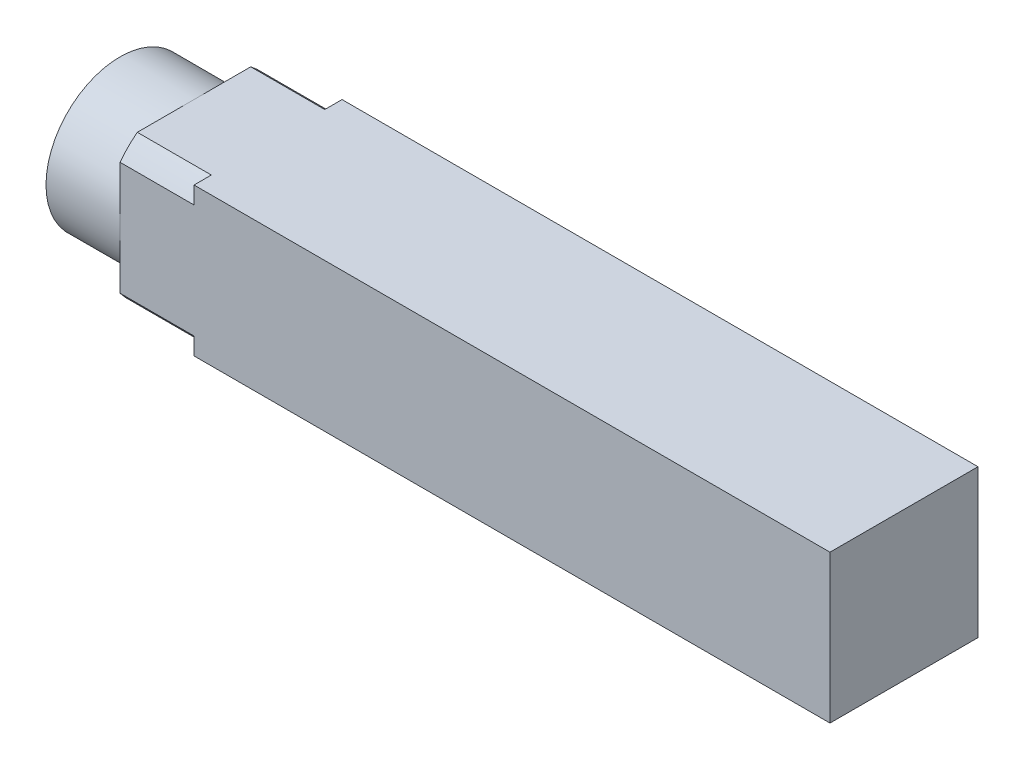
ISO-10303-21;
HEADER;
FILE_DESCRIPTION(('STEP AP214'),'2;1');
FILE_NAME('part.step','',(''),(''),'','','');
FILE_SCHEMA(('AUTOMOTIVE_DESIGN { 1 0 10303 214 1 1 1 1 }'));
ENDSEC;
DATA;
#1=APPLICATION_CONTEXT('core data for automotive mechanical design processes');
#2=APPLICATION_PROTOCOL_DEFINITION('international standard','automotive_design',2000,#1);
#3=PRODUCT_CONTEXT('',#1,'mechanical');
#4=PRODUCT('Part','Part','',(#3));
#5=PRODUCT_RELATED_PRODUCT_CATEGORY('part','',(#4));
#6=PRODUCT_DEFINITION_FORMATION('','',#4);
#7=PRODUCT_DEFINITION_CONTEXT('part definition',#1,'design');
#8=PRODUCT_DEFINITION('design','',#6,#7);
#9=PRODUCT_DEFINITION_SHAPE('','',#8);
#10=(LENGTH_UNIT() NAMED_UNIT(*) SI_UNIT(.MILLI.,.METRE.));
#11=(NAMED_UNIT(*) PLANE_ANGLE_UNIT() SI_UNIT($,.RADIAN.));
#12=(NAMED_UNIT(*) SI_UNIT($,.STERADIAN.) SOLID_ANGLE_UNIT());
#13=UNCERTAINTY_MEASURE_WITH_UNIT(LENGTH_MEASURE(1.E-05),#10,'distance_accuracy_value','');
#14=(GEOMETRIC_REPRESENTATION_CONTEXT(3) GLOBAL_UNCERTAINTY_ASSIGNED_CONTEXT((#13)) GLOBAL_UNIT_ASSIGNED_CONTEXT((#10,
#11,#12)) REPRESENTATION_CONTEXT('',''));
#15=CARTESIAN_POINT('',(0.,0.,0.));
#16=DIRECTION('',(0.,0.,1.));
#17=DIRECTION('',(1.,0.,0.));
#18=AXIS2_PLACEMENT_3D('',#15,#16,#17);
#19=CARTESIAN_POINT('',(3.175,0.,0.));
#20=DIRECTION('',(-1.,0.,0.));
#21=DIRECTION('',(0.,0.,1.));
#22=AXIS2_PLACEMENT_3D('',#19,#20,#21);
#23=PLANE('',#22);
#24=CARTESIAN_POINT('',(3.175,0.,0.));
#25=DIRECTION('',(1.,0.,0.));
#26=DIRECTION('',(0.,0.,-1.));
#27=AXIS2_PLACEMENT_3D('',#24,#25,#26);
#28=CIRCLE('',#27,4.);
#29=CARTESIAN_POINT('',(3.175,3.175,2.43297657202037));
#30=VERTEX_POINT('',#29);
#31=CARTESIAN_POINT('',(3.175,2.43297657202037,3.175));
#32=VERTEX_POINT('',#31);
#33=EDGE_CURVE('E250',#30,#32,#28,.T.);
#34=ORIENTED_EDGE('',*,*,#33,.F.);
#35=DIRECTION('',(0.,0.,-1.));
#36=VECTOR('',#35,1.);
#37=CARTESIAN_POINT('',(3.175,3.175,3.175));
#38=LINE('',#37,#36);
#39=CARTESIAN_POINT('',(3.175,3.175,0.));
#40=VERTEX_POINT('',#39);
#41=EDGE_CURVE('E199',#30,#40,#38,.T.);
#42=ORIENTED_EDGE('',*,*,#41,.T.);
#43=CARTESIAN_POINT('',(3.175,0.,0.));
#44=DIRECTION('',(-1.,0.,0.));
#45=DIRECTION('',(0.,0.,1.));
#46=AXIS2_PLACEMENT_3D('',#43,#44,#45);
#47=CIRCLE('',#46,3.175);
#48=CARTESIAN_POINT('',(3.175,0.,3.175));
#49=VERTEX_POINT('',#48);
#50=EDGE_CURVE('E185',#49,#40,#47,.T.);
#51=ORIENTED_EDGE('',*,*,#50,.F.);
#52=DIRECTION('',(0.,1.,0.));
#53=VECTOR('',#52,1.);
#54=CARTESIAN_POINT('',(3.175,-3.175,3.175));
#55=LINE('',#54,#53);
#56=EDGE_CURVE('E193',#49,#32,#55,.T.);
#57=ORIENTED_EDGE('',*,*,#56,.T.);
#58=EDGE_LOOP('',(#34,#42,#51,#57));
#59=FACE_BOUND('',#58,.T.);
#60=ADVANCED_FACE('F39',(#59),#23,.T.);
#61=CARTESIAN_POINT('',(3.175,0.,0.));
#62=DIRECTION('',(1.,0.,0.));
#63=DIRECTION('',(0.,0.,-1.));
#64=AXIS2_PLACEMENT_3D('',#61,#62,#63);
#65=CIRCLE('',#64,4.);
#66=CARTESIAN_POINT('',(3.175,2.43297657202037,-3.175));
#67=VERTEX_POINT('',#66);
#68=CARTESIAN_POINT('',(3.175,3.175,-2.43297657202037));
#69=VERTEX_POINT('',#68);
#70=EDGE_CURVE('E249',#67,#69,#65,.T.);
#71=ORIENTED_EDGE('',*,*,#70,.F.);
#72=DIRECTION('',(0.,-1.,0.));
#73=VECTOR('',#72,1.);
#74=CARTESIAN_POINT('',(3.175,-3.175,-3.175));
#75=LINE('',#74,#73);
#76=CARTESIAN_POINT('',(3.175,0.,-3.175));
#77=VERTEX_POINT('',#76);
#78=EDGE_CURVE('E198',#67,#77,#75,.T.);
#79=ORIENTED_EDGE('',*,*,#78,.T.);
#80=EDGE_CURVE('E186',#40,#77,#47,.T.);
#81=ORIENTED_EDGE('',*,*,#80,.F.);
#82=EDGE_CURVE('E197',#40,#69,#38,.T.);
#83=ORIENTED_EDGE('',*,*,#82,.T.);
#84=EDGE_LOOP('',(#71,#79,#81,#83));
#85=FACE_BOUND('',#84,.T.);
#86=ADVANCED_FACE('F271',(#85),#23,.T.);
#87=CARTESIAN_POINT('',(3.175,0.,0.));
#88=DIRECTION('',(1.,0.,0.));
#89=DIRECTION('',(0.,0.,-1.));
#90=AXIS2_PLACEMENT_3D('',#87,#88,#89);
#91=CIRCLE('',#90,4.);
#92=CARTESIAN_POINT('',(3.175,-3.175,-2.43297657202037));
#93=VERTEX_POINT('',#92);
#94=CARTESIAN_POINT('',(3.175,-2.43297657202037,-3.175));
#95=VERTEX_POINT('',#94);
#96=EDGE_CURVE('E230',#93,#95,#91,.T.);
#97=ORIENTED_EDGE('',*,*,#96,.F.);
#98=DIRECTION('',(0.,0.,1.));
#99=VECTOR('',#98,1.);
#100=CARTESIAN_POINT('',(3.175,-3.175,3.175));
#101=LINE('',#100,#99);
#102=CARTESIAN_POINT('',(3.175,-3.175,0.));
#103=VERTEX_POINT('',#102);
#104=EDGE_CURVE('E147',#93,#103,#101,.T.);
#105=ORIENTED_EDGE('',*,*,#104,.T.);
#106=EDGE_CURVE('E229',#77,#103,#47,.T.);
#107=ORIENTED_EDGE('',*,*,#106,.F.);
#108=EDGE_CURVE('E195',#77,#95,#75,.T.);
#109=ORIENTED_EDGE('',*,*,#108,.T.);
#110=EDGE_LOOP('',(#97,#105,#107,#109));
#111=FACE_BOUND('',#110,.T.);
#112=ADVANCED_FACE('F227',(#111),#23,.T.);
#113=CARTESIAN_POINT('',(3.175,0.,0.));
#114=DIRECTION('',(1.,0.,0.));
#115=DIRECTION('',(0.,0.,-1.));
#116=AXIS2_PLACEMENT_3D('',#113,#114,#115);
#117=CIRCLE('',#116,4.);
#118=CARTESIAN_POINT('',(3.175,-2.43297657202037,3.175));
#119=VERTEX_POINT('',#118);
#120=CARTESIAN_POINT('',(3.175,-3.175,2.43297657202037));
#121=VERTEX_POINT('',#120);
#122=EDGE_CURVE('E243',#119,#121,#117,.T.);
#123=ORIENTED_EDGE('',*,*,#122,.F.);
#124=EDGE_CURVE('E183',#119,#49,#55,.T.);
#125=ORIENTED_EDGE('',*,*,#124,.T.);
#126=EDGE_CURVE('E187',#103,#49,#47,.T.);
#127=ORIENTED_EDGE('',*,*,#126,.F.);
#128=EDGE_CURVE('E218',#103,#121,#101,.T.);
#129=ORIENTED_EDGE('',*,*,#128,.T.);
#130=EDGE_LOOP('',(#123,#125,#127,#129));
#131=FACE_BOUND('',#130,.T.);
#132=ADVANCED_FACE('F240',(#131),#23,.T.);
#133=CARTESIAN_POINT('',(33.63214,-3.175,-3.175));
#134=DIRECTION('',(0.,0.,1.));
#135=DIRECTION('',(1.,0.,0.));
#136=AXIS2_PLACEMENT_3D('',#133,#134,#135);
#137=PLANE('',#136);
#138=DIRECTION('',(-1.,0.,0.));
#139=VECTOR('',#138,1.);
#140=CARTESIAN_POINT('',(33.63214,-3.175,-3.175));
#141=LINE('',#140,#139);
#142=CARTESIAN_POINT('',(33.63214,-3.175,-3.175));
#143=VERTEX_POINT('',#142);
#144=CARTESIAN_POINT('',(6.35,-3.175,-3.175));
#145=VERTEX_POINT('',#144);
#146=EDGE_CURVE('E209',#143,#145,#141,.T.);
#147=ORIENTED_EDGE('',*,*,#146,.T.);
#148=DIRECTION('',(0.,1.,0.));
#149=VECTOR('',#148,1.);
#150=CARTESIAN_POINT('',(6.35,-3.175,-3.175));
#151=LINE('',#150,#149);
#152=CARTESIAN_POINT('',(6.35,-2.43297657202037,-3.175));
#153=VERTEX_POINT('',#152);
#154=EDGE_CURVE('E144',#145,#153,#151,.T.);
#155=ORIENTED_EDGE('',*,*,#154,.T.);
#156=DIRECTION('',(-1.,0.,0.));
#157=VECTOR('',#156,1.);
#158=CARTESIAN_POINT('',(6.35,-2.43297657202037,-3.175));
#159=LINE('',#158,#157);
#160=EDGE_CURVE('E156',#153,#95,#159,.T.);
#161=ORIENTED_EDGE('',*,*,#160,.T.);
#162=ORIENTED_EDGE('',*,*,#108,.F.);
#163=ORIENTED_EDGE('',*,*,#78,.F.);
#164=DIRECTION('',(-1.,0.,0.));
#165=VECTOR('',#164,1.);
#166=CARTESIAN_POINT('',(6.35,2.43297657202037,-3.175));
#167=LINE('',#166,#165);
#168=CARTESIAN_POINT('',(6.35,2.43297657202037,-3.175));
#169=VERTEX_POINT('',#168);
#170=EDGE_CURVE('E169',#169,#67,#167,.T.);
#171=ORIENTED_EDGE('',*,*,#170,.F.);
#172=CARTESIAN_POINT('',(6.35,3.175,-3.175));
#173=VERTEX_POINT('',#172);
#174=EDGE_CURVE('E173',#169,#173,#151,.T.);
#175=ORIENTED_EDGE('',*,*,#174,.T.);
#176=DIRECTION('',(-1.,0.,0.));
#177=VECTOR('',#176,1.);
#178=CARTESIAN_POINT('',(33.63214,3.175,-3.175));
#179=LINE('',#178,#177);
#180=CARTESIAN_POINT('',(33.63214,3.175,-3.175));
#181=VERTEX_POINT('',#180);
#182=EDGE_CURVE('E220',#181,#173,#179,.T.);
#183=ORIENTED_EDGE('',*,*,#182,.F.);
#184=DIRECTION('',(0.,1.,0.));
#185=VECTOR('',#184,1.);
#186=CARTESIAN_POINT('',(33.63214,-3.175,-3.175));
#187=LINE('',#186,#185);
#188=EDGE_CURVE('E203',#143,#181,#187,.T.);
#189=ORIENTED_EDGE('',*,*,#188,.F.);
#190=EDGE_LOOP('',(#147,#155,#161,#162,#163,#171,#175,#183,#189));
#191=FACE_BOUND('',#190,.T.);
#192=ADVANCED_FACE('F41',(#191),#137,.F.);
#193=CARTESIAN_POINT('',(33.63214,3.175,3.175));
#194=DIRECTION('',(0.,-1.,0.));
#195=DIRECTION('',(0.,0.,-1.));
#196=AXIS2_PLACEMENT_3D('',#193,#194,#195);
#197=PLANE('',#196);
#198=ORIENTED_EDGE('',*,*,#182,.T.);
#199=DIRECTION('',(0.,0.,1.));
#200=VECTOR('',#199,1.);
#201=CARTESIAN_POINT('',(6.35,3.175,3.175));
#202=LINE('',#201,#200);
#203=CARTESIAN_POINT('',(6.35,3.175,-2.43297657202037));
#204=VERTEX_POINT('',#203);
#205=EDGE_CURVE('E182',#173,#204,#202,.T.);
#206=ORIENTED_EDGE('',*,*,#205,.T.);
#207=DIRECTION('',(-1.,0.,0.));
#208=VECTOR('',#207,1.);
#209=CARTESIAN_POINT('',(6.35,3.175,-2.43297657202037));
#210=LINE('',#209,#208);
#211=EDGE_CURVE('E53',#204,#69,#210,.T.);
#212=ORIENTED_EDGE('',*,*,#211,.T.);
#213=ORIENTED_EDGE('',*,*,#82,.F.);
#214=ORIENTED_EDGE('',*,*,#41,.F.);
#215=DIRECTION('',(-1.,0.,0.));
#216=VECTOR('',#215,1.);
#217=CARTESIAN_POINT('',(6.35,3.175,2.43297657202037));
#218=LINE('',#217,#216);
#219=CARTESIAN_POINT('',(6.35,3.175,2.43297657202037));
#220=VERTEX_POINT('',#219);
#221=EDGE_CURVE('E265',#220,#30,#218,.T.);
#222=ORIENTED_EDGE('',*,*,#221,.F.);
#223=CARTESIAN_POINT('',(6.35,3.175,3.175));
#224=VERTEX_POINT('',#223);
#225=EDGE_CURVE('E178',#220,#224,#202,.T.);
#226=ORIENTED_EDGE('',*,*,#225,.T.);
#227=DIRECTION('',(-1.,0.,0.));
#228=VECTOR('',#227,1.);
#229=CARTESIAN_POINT('',(33.63214,3.175,3.175));
#230=LINE('',#229,#228);
#231=CARTESIAN_POINT('',(33.63214,3.175,3.175));
#232=VERTEX_POINT('',#231);
#233=EDGE_CURVE('E212',#232,#224,#230,.T.);
#234=ORIENTED_EDGE('',*,*,#233,.F.);
#235=DIRECTION('',(0.,0.,1.));
#236=VECTOR('',#235,1.);
#237=CARTESIAN_POINT('',(33.63214,3.175,3.175));
#238=LINE('',#237,#236);
#239=EDGE_CURVE('E204',#181,#232,#238,.T.);
#240=ORIENTED_EDGE('',*,*,#239,.F.);
#241=EDGE_LOOP('',(#198,#206,#212,#213,#214,#222,#226,#234,#240));
#242=FACE_BOUND('',#241,.T.);
#243=ADVANCED_FACE('F285',(#242),#197,.F.);
#244=CARTESIAN_POINT('',(33.63214,-3.175,3.175));
#245=DIRECTION('',(0.,0.,-1.));
#246=DIRECTION('',(-1.,0.,0.));
#247=AXIS2_PLACEMENT_3D('',#244,#245,#246);
#248=PLANE('',#247);
#249=ORIENTED_EDGE('',*,*,#233,.T.);
#250=DIRECTION('',(0.,-1.,0.));
#251=VECTOR('',#250,1.);
#252=CARTESIAN_POINT('',(6.35,-3.175,3.175));
#253=LINE('',#252,#251);
#254=CARTESIAN_POINT('',(6.35,2.43297657202037,3.175));
#255=VERTEX_POINT('',#254);
#256=EDGE_CURVE('E180',#224,#255,#253,.T.);
#257=ORIENTED_EDGE('',*,*,#256,.T.);
#258=DIRECTION('',(-1.,0.,0.));
#259=VECTOR('',#258,1.);
#260=CARTESIAN_POINT('',(6.35,2.43297657202037,3.175));
#261=LINE('',#260,#259);
#262=EDGE_CURVE('E259',#255,#32,#261,.T.);
#263=ORIENTED_EDGE('',*,*,#262,.T.);
#264=ORIENTED_EDGE('',*,*,#56,.F.);
#265=ORIENTED_EDGE('',*,*,#124,.F.);
#266=DIRECTION('',(-1.,0.,0.));
#267=VECTOR('',#266,1.);
#268=CARTESIAN_POINT('',(6.35,-2.43297657202037,3.175));
#269=LINE('',#268,#267);
#270=CARTESIAN_POINT('',(6.35,-2.43297657202037,3.175));
#271=VERTEX_POINT('',#270);
#272=EDGE_CURVE('E255',#271,#119,#269,.T.);
#273=ORIENTED_EDGE('',*,*,#272,.F.);
#274=CARTESIAN_POINT('',(6.35,-3.175,3.175));
#275=VERTEX_POINT('',#274);
#276=EDGE_CURVE('E174',#271,#275,#253,.T.);
#277=ORIENTED_EDGE('',*,*,#276,.T.);
#278=DIRECTION('',(-1.,0.,0.));
#279=VECTOR('',#278,1.);
#280=CARTESIAN_POINT('',(33.63214,-3.175,3.175));
#281=LINE('',#280,#279);
#282=CARTESIAN_POINT('',(33.63214,-3.175,3.175));
#283=VERTEX_POINT('',#282);
#284=EDGE_CURVE('E215',#283,#275,#281,.T.);
#285=ORIENTED_EDGE('',*,*,#284,.F.);
#286=DIRECTION('',(0.,-1.,0.));
#287=VECTOR('',#286,1.);
#288=CARTESIAN_POINT('',(33.63214,-3.175,3.175));
#289=LINE('',#288,#287);
#290=EDGE_CURVE('E206',#232,#283,#289,.T.);
#291=ORIENTED_EDGE('',*,*,#290,.F.);
#292=EDGE_LOOP('',(#249,#257,#263,#264,#265,#273,#277,#285,#291));
#293=FACE_BOUND('',#292,.T.);
#294=ADVANCED_FACE('F276',(#293),#248,.F.);
#295=CARTESIAN_POINT('',(33.63214,-3.175,3.175));
#296=DIRECTION('',(0.,1.,0.));
#297=DIRECTION('',(0.,0.,1.));
#298=AXIS2_PLACEMENT_3D('',#295,#296,#297);
#299=PLANE('',#298);
#300=ORIENTED_EDGE('',*,*,#284,.T.);
#301=DIRECTION('',(0.,0.,-1.));
#302=VECTOR('',#301,1.);
#303=CARTESIAN_POINT('',(6.35,-3.175,3.175));
#304=LINE('',#303,#302);
#305=CARTESIAN_POINT('',(6.35,-3.175,2.43297657202037));
#306=VERTEX_POINT('',#305);
#307=EDGE_CURVE('E11',#275,#306,#304,.T.);
#308=ORIENTED_EDGE('',*,*,#307,.T.);
#309=DIRECTION('',(-1.,0.,0.));
#310=VECTOR('',#309,1.);
#311=CARTESIAN_POINT('',(6.35,-3.175,2.43297657202037));
#312=LINE('',#311,#310);
#313=EDGE_CURVE('E163',#306,#121,#312,.T.);
#314=ORIENTED_EDGE('',*,*,#313,.T.);
#315=ORIENTED_EDGE('',*,*,#128,.F.);
#316=ORIENTED_EDGE('',*,*,#104,.F.);
#317=DIRECTION('',(-1.,0.,0.));
#318=VECTOR('',#317,1.);
#319=CARTESIAN_POINT('',(6.35,-3.175,-2.43297657202037));
#320=LINE('',#319,#318);
#321=CARTESIAN_POINT('',(6.35,-3.175,-2.43297657202037));
#322=VERTEX_POINT('',#321);
#323=EDGE_CURVE('E153',#322,#93,#320,.T.);
#324=ORIENTED_EDGE('',*,*,#323,.F.);
#325=EDGE_CURVE('E43',#322,#145,#304,.T.);
#326=ORIENTED_EDGE('',*,*,#325,.T.);
#327=ORIENTED_EDGE('',*,*,#146,.F.);
#328=DIRECTION('',(0.,0.,-1.));
#329=VECTOR('',#328,1.);
#330=CARTESIAN_POINT('',(33.63214,-3.175,3.175));
#331=LINE('',#330,#329);
#332=EDGE_CURVE('E208',#283,#143,#331,.T.);
#333=ORIENTED_EDGE('',*,*,#332,.F.);
#334=EDGE_LOOP('',(#300,#308,#314,#315,#316,#324,#326,#327,#333));
#335=FACE_BOUND('',#334,.T.);
#336=ADVANCED_FACE('F165',(#335),#299,.F.);
#337=CARTESIAN_POINT('',(33.63214,0.,0.));
#338=DIRECTION('',(-1.,0.,0.));
#339=DIRECTION('',(0.,0.,1.));
#340=AXIS2_PLACEMENT_3D('',#337,#338,#339);
#341=PLANE('',#340);
#342=ORIENTED_EDGE('',*,*,#188,.T.);
#343=ORIENTED_EDGE('',*,*,#239,.T.);
#344=ORIENTED_EDGE('',*,*,#290,.T.);
#345=ORIENTED_EDGE('',*,*,#332,.T.);
#346=EDGE_LOOP('',(#342,#343,#344,#345));
#347=FACE_BOUND('',#346,.T.);
#348=ADVANCED_FACE('F387',(#347),#341,.F.);
#349=CARTESIAN_POINT('',(3.175,0.,0.));
#350=DIRECTION('',(-1.,0.,0.));
#351=DIRECTION('',(0.,0.,1.));
#352=AXIS2_PLACEMENT_3D('',#349,#350,#351);
#353=CYLINDRICAL_SURFACE('',#352,3.175);
#354=CARTESIAN_POINT('',(0.,0.,0.));
#355=DIRECTION('',(-1.,0.,0.));
#356=DIRECTION('',(0.,0.,1.));
#357=AXIS2_PLACEMENT_3D('',#354,#355,#356);
#358=CIRCLE('',#357,3.175);
#359=CARTESIAN_POINT('',(0.,0.,3.175));
#360=VERTEX_POINT('',#359);
#361=EDGE_CURVE('E189',#360,#360,#358,.T.);
#362=ORIENTED_EDGE('',*,*,#361,.F.);
#363=EDGE_LOOP('',(#362));
#364=FACE_BOUND('',#363,.T.);
#365=ORIENTED_EDGE('',*,*,#80,.T.);
#366=ORIENTED_EDGE('',*,*,#106,.T.);
#367=ORIENTED_EDGE('',*,*,#126,.T.);
#368=ORIENTED_EDGE('',*,*,#50,.T.);
#369=EDGE_LOOP('',(#365,#366,#367,#368));
#370=FACE_BOUND('',#369,.T.);
#371=ADVANCED_FACE('F233',(#364,#370),#353,.T.);
#372=CARTESIAN_POINT('',(0.,0.,0.));
#373=DIRECTION('',(-1.,0.,0.));
#374=DIRECTION('',(0.,0.,1.));
#375=AXIS2_PLACEMENT_3D('',#372,#373,#374);
#376=PLANE('',#375);
#377=ORIENTED_EDGE('',*,*,#361,.T.);
#378=EDGE_LOOP('',(#377));
#379=FACE_BOUND('',#378,.T.);
#380=ADVANCED_FACE('F301',(#379),#376,.T.);
#381=CARTESIAN_POINT('',(6.35,0.,0.));
#382=DIRECTION('',(1.,0.,0.));
#383=DIRECTION('',(0.,0.,-1.));
#384=AXIS2_PLACEMENT_3D('',#381,#382,#383);
#385=PLANE('',#384);
#386=ORIENTED_EDGE('',*,*,#325,.F.);
#387=CARTESIAN_POINT('',(6.35,0.,0.));
#388=DIRECTION('',(1.,0.,0.));
#389=DIRECTION('',(0.,0.,-1.));
#390=AXIS2_PLACEMENT_3D('',#387,#388,#389);
#391=CIRCLE('',#390,4.);
#392=EDGE_CURVE('E142',#322,#153,#391,.T.);
#393=ORIENTED_EDGE('',*,*,#392,.T.);
#394=ORIENTED_EDGE('',*,*,#154,.F.);
#395=EDGE_LOOP('',(#386,#393,#394));
#396=FACE_BOUND('',#395,.T.);
#397=ADVANCED_FACE('F143',(#396),#385,.F.);
#398=CARTESIAN_POINT('',(6.35,0.,0.));
#399=DIRECTION('',(-1.,0.,0.));
#400=DIRECTION('',(0.,0.,1.));
#401=AXIS2_PLACEMENT_3D('',#398,#399,#400);
#402=CYLINDRICAL_SURFACE('',#401,4.);
#403=ORIENTED_EDGE('',*,*,#96,.T.);
#404=ORIENTED_EDGE('',*,*,#160,.F.);
#405=ORIENTED_EDGE('',*,*,#392,.F.);
#406=ORIENTED_EDGE('',*,*,#323,.T.);
#407=EDGE_LOOP('',(#403,#404,#405,#406));
#408=FACE_BOUND('',#407,.T.);
#409=ADVANCED_FACE('F155',(#408),#402,.T.);
#410=CARTESIAN_POINT('',(6.35,0.,0.));
#411=DIRECTION('',(1.,0.,0.));
#412=DIRECTION('',(0.,0.,-1.));
#413=AXIS2_PLACEMENT_3D('',#410,#411,#412);
#414=CIRCLE('',#413,4.);
#415=EDGE_CURVE('E158',#271,#306,#414,.T.);
#416=ORIENTED_EDGE('',*,*,#415,.T.);
#417=ORIENTED_EDGE('',*,*,#307,.F.);
#418=ORIENTED_EDGE('',*,*,#276,.F.);
#419=EDGE_LOOP('',(#416,#417,#418));
#420=FACE_BOUND('',#419,.T.);
#421=ADVANCED_FACE('F247',(#420),#385,.F.);
#422=CARTESIAN_POINT('',(6.35,0.,0.));
#423=DIRECTION('',(-1.,0.,0.));
#424=DIRECTION('',(0.,0.,1.));
#425=AXIS2_PLACEMENT_3D('',#422,#423,#424);
#426=CYLINDRICAL_SURFACE('',#425,4.);
#427=ORIENTED_EDGE('',*,*,#122,.T.);
#428=ORIENTED_EDGE('',*,*,#313,.F.);
#429=ORIENTED_EDGE('',*,*,#415,.F.);
#430=ORIENTED_EDGE('',*,*,#272,.T.);
#431=EDGE_LOOP('',(#427,#428,#429,#430));
#432=FACE_BOUND('',#431,.T.);
#433=ADVANCED_FACE('F242',(#432),#426,.T.);
#434=CARTESIAN_POINT('',(6.35,0.,0.));
#435=DIRECTION('',(1.,0.,0.));
#436=DIRECTION('',(0.,0.,-1.));
#437=AXIS2_PLACEMENT_3D('',#434,#435,#436);
#438=CIRCLE('',#437,4.);
#439=EDGE_CURVE('E62',#220,#255,#438,.T.);
#440=ORIENTED_EDGE('',*,*,#439,.T.);
#441=ORIENTED_EDGE('',*,*,#256,.F.);
#442=ORIENTED_EDGE('',*,*,#225,.F.);
#443=EDGE_LOOP('',(#440,#441,#442));
#444=FACE_BOUND('',#443,.T.);
#445=ADVANCED_FACE('F294',(#444),#385,.F.);
#446=CARTESIAN_POINT('',(6.35,0.,0.));
#447=DIRECTION('',(-1.,0.,0.));
#448=DIRECTION('',(0.,0.,1.));
#449=AXIS2_PLACEMENT_3D('',#446,#447,#448);
#450=CYLINDRICAL_SURFACE('',#449,4.);
#451=ORIENTED_EDGE('',*,*,#33,.T.);
#452=ORIENTED_EDGE('',*,*,#262,.F.);
#453=ORIENTED_EDGE('',*,*,#439,.F.);
#454=ORIENTED_EDGE('',*,*,#221,.T.);
#455=EDGE_LOOP('',(#451,#452,#453,#454));
#456=FACE_BOUND('',#455,.T.);
#457=ADVANCED_FACE('F282',(#456),#450,.T.);
#458=CARTESIAN_POINT('',(6.35,0.,0.));
#459=DIRECTION('',(1.,0.,0.));
#460=DIRECTION('',(0.,0.,-1.));
#461=AXIS2_PLACEMENT_3D('',#458,#459,#460);
#462=CIRCLE('',#461,4.);
#463=EDGE_CURVE('E160',#169,#204,#462,.T.);
#464=ORIENTED_EDGE('',*,*,#463,.T.);
#465=ORIENTED_EDGE('',*,*,#205,.F.);
#466=ORIENTED_EDGE('',*,*,#174,.F.);
#467=EDGE_LOOP('',(#464,#465,#466));
#468=FACE_BOUND('',#467,.T.);
#469=ADVANCED_FACE('F292',(#468),#385,.F.);
#470=CARTESIAN_POINT('',(6.35,0.,0.));
#471=DIRECTION('',(-1.,0.,0.));
#472=DIRECTION('',(0.,0.,1.));
#473=AXIS2_PLACEMENT_3D('',#470,#471,#472);
#474=CYLINDRICAL_SURFACE('',#473,4.);
#475=ORIENTED_EDGE('',*,*,#70,.T.);
#476=ORIENTED_EDGE('',*,*,#211,.F.);
#477=ORIENTED_EDGE('',*,*,#463,.F.);
#478=ORIENTED_EDGE('',*,*,#170,.T.);
#479=EDGE_LOOP('',(#475,#476,#477,#478));
#480=FACE_BOUND('',#479,.T.);
#481=ADVANCED_FACE('F266',(#480),#474,.T.);
#482=CLOSED_SHELL('',(#60,#86,#112,#132,#192,#243,#294,#336,#348,#371,#380,#397,#409,#421,#433,
#445,#457,#469,#481));
#483=MANIFOLD_SOLID_BREP('B2',#482);
#484=ADVANCED_BREP_SHAPE_REPRESENTATION('',(#18,#483),#14);
#485=SHAPE_DEFINITION_REPRESENTATION(#9,#484);
ENDSEC;
END-ISO-10303-21;
